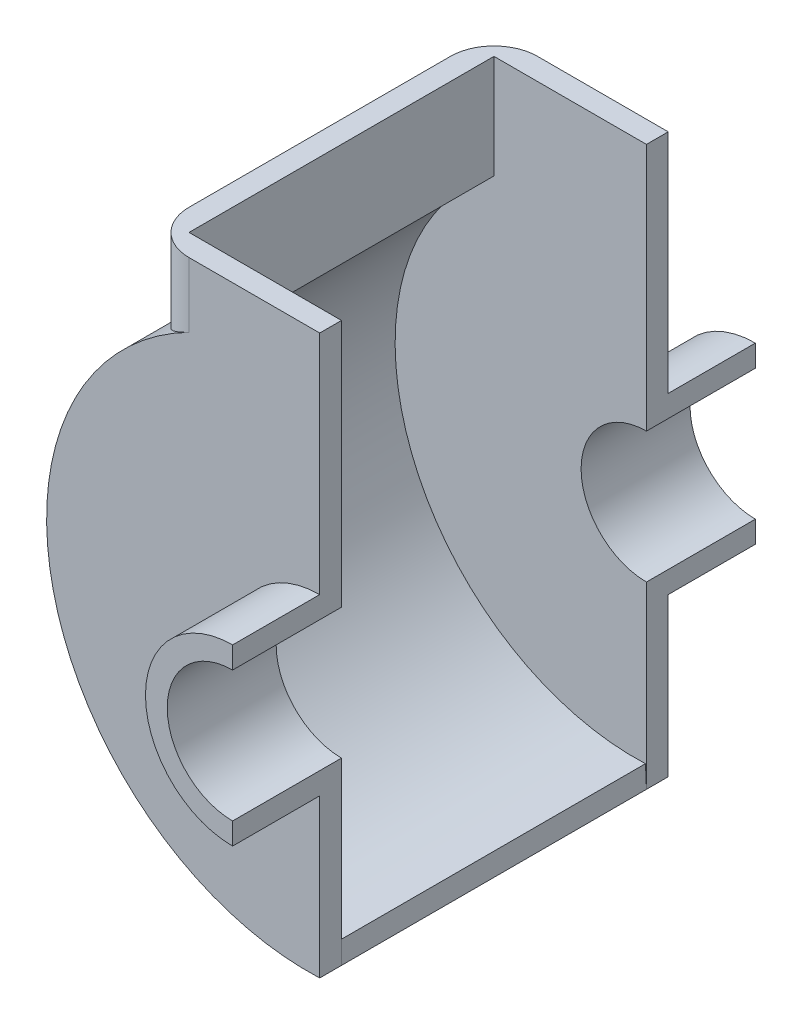
ISO-10303-21;
HEADER;
FILE_DESCRIPTION(('STEP AP214'),'2;1');
FILE_NAME('part.step','',(''),(''),'','','');
FILE_SCHEMA(('AUTOMOTIVE_DESIGN { 1 0 10303 214 1 1 1 1 }'));
ENDSEC;
DATA;
#1=APPLICATION_CONTEXT('core data for automotive mechanical design processes');
#2=APPLICATION_PROTOCOL_DEFINITION('international standard','automotive_design',2000,#1);
#3=PRODUCT_CONTEXT('',#1,'mechanical');
#4=PRODUCT('Part','Part','',(#3));
#5=PRODUCT_RELATED_PRODUCT_CATEGORY('part','',(#4));
#6=PRODUCT_DEFINITION_FORMATION('','',#4);
#7=PRODUCT_DEFINITION_CONTEXT('part definition',#1,'design');
#8=PRODUCT_DEFINITION('design','',#6,#7);
#9=PRODUCT_DEFINITION_SHAPE('','',#8);
#10=(LENGTH_UNIT() NAMED_UNIT(*) SI_UNIT(.MILLI.,.METRE.));
#11=(NAMED_UNIT(*) PLANE_ANGLE_UNIT() SI_UNIT($,.RADIAN.));
#12=(NAMED_UNIT(*) SI_UNIT($,.STERADIAN.) SOLID_ANGLE_UNIT());
#13=UNCERTAINTY_MEASURE_WITH_UNIT(LENGTH_MEASURE(1.E-05),#10,'distance_accuracy_value','');
#14=(GEOMETRIC_REPRESENTATION_CONTEXT(3) GLOBAL_UNCERTAINTY_ASSIGNED_CONTEXT((#13)) GLOBAL_UNIT_ASSIGNED_CONTEXT((#10,
#11,#12)) REPRESENTATION_CONTEXT('',''));
#15=CARTESIAN_POINT('',(0.,0.,0.));
#16=DIRECTION('',(0.,0.,1.));
#17=DIRECTION('',(1.,0.,0.));
#18=AXIS2_PLACEMENT_3D('',#15,#16,#17);
#19=CARTESIAN_POINT('',(0.,0.,0.));
#20=DIRECTION('',(0.,0.,1.));
#21=DIRECTION('',(1.,0.,0.));
#22=AXIS2_PLACEMENT_3D('',#19,#20,#21);
#23=PLANE('',#22);
#24=DIRECTION('',(0.,1.,0.));
#25=VECTOR('',#24,1.);
#26=CARTESIAN_POINT('',(-35.,72.,0.));
#27=LINE('',#26,#25);
#28=CARTESIAN_POINT('',(-35.,72.,0.));
#29=VERTEX_POINT('',#28);
#30=CARTESIAN_POINT('',(-35.,48.2294254543984,0.));
#31=VERTEX_POINT('',#30);
#32=EDGE_CURVE('E271',#29,#31,#27,.F.);
#33=ORIENTED_EDGE('',*,*,#32,.F.);
#34=DIRECTION('',(-1.,0.,0.));
#35=VECTOR('',#34,1.);
#36=CARTESIAN_POINT('',(0.,72.,0.));
#37=LINE('',#36,#35);
#38=CARTESIAN_POINT('',(0.,72.,0.));
#39=VERTEX_POINT('',#38);
#40=EDGE_CURVE('E269',#39,#29,#37,.T.);
#41=ORIENTED_EDGE('',*,*,#40,.F.);
#42=DIRECTION('',(0.,1.,0.));
#43=VECTOR('',#42,1.);
#44=CARTESIAN_POINT('',(0.,15.,0.));
#45=LINE('',#44,#43);
#46=CARTESIAN_POINT('',(0.,15.,0.));
#47=VERTEX_POINT('',#46);
#48=EDGE_CURVE('E347',#47,#39,#45,.T.);
#49=ORIENTED_EDGE('',*,*,#48,.F.);
#50=CARTESIAN_POINT('',(0.,0.,0.));
#51=DIRECTION('',(0.,0.,-1.));
#52=DIRECTION('',(1.,0.,0.));
#53=AXIS2_PLACEMENT_3D('',#50,#51,#52);
#54=CIRCLE('',#53,15.);
#55=CARTESIAN_POINT('',(0.,-15.,0.));
#56=VERTEX_POINT('',#55);
#57=EDGE_CURVE('E328',#56,#47,#54,.T.);
#58=ORIENTED_EDGE('',*,*,#57,.F.);
#59=DIRECTION('',(0.,1.,0.));
#60=VECTOR('',#59,1.);
#61=CARTESIAN_POINT('',(0.,-15.,0.));
#62=LINE('',#61,#60);
#63=CARTESIAN_POINT('',(0.,-56.2204786512153,0.));
#64=VERTEX_POINT('',#63);
#65=EDGE_CURVE('E334',#64,#56,#62,.T.);
#66=ORIENTED_EDGE('',*,*,#65,.F.);
#67=DIRECTION('',(-0.0448600408326044,0.998993281627308,0.));
#68=VECTOR('',#67,1.);
#69=CARTESIAN_POINT('',(0.,-56.2204786512153,0.));
#70=LINE('',#69,#68);
#71=CARTESIAN_POINT('',(-0.224300204163022,-51.2255122430787,0.));
#72=VERTEX_POINT('',#71);
#73=EDGE_CURVE('E270',#64,#72,#70,.T.);
#74=ORIENTED_EDGE('',*,*,#73,.T.);
#75=CARTESIAN_POINT('',(-2.69160244995626,3.71911824642318,0.));
#76=DIRECTION('',(0.,0.,-1.));
#77=DIRECTION('',(-1.,0.,0.));
#78=AXIS2_PLACEMENT_3D('',#75,#76,#77);
#79=CIRCLE('',#78,55.);
#80=EDGE_CURVE('E266',#31,#72,#79,.F.);
#81=ORIENTED_EDGE('',*,*,#80,.F.);
#82=EDGE_LOOP('',(#33,#41,#49,#58,#66,#74,#81));
#83=FACE_BOUND('',#82,.T.);
#84=ADVANCED_FACE('F38',(#83),#23,.F.);
#85=CARTESIAN_POINT('',(0.,0.,25.));
#86=DIRECTION('',(0.,0.,-1.));
#87=DIRECTION('',(-1.,0.,0.));
#88=AXIS2_PLACEMENT_3D('',#85,#86,#87);
#89=CYLINDRICAL_SURFACE('',#88,15.);
#90=DIRECTION('',(0.,0.,-1.));
#91=VECTOR('',#90,1.);
#92=CARTESIAN_POINT('',(0.,-15.,25.));
#93=LINE('',#92,#91);
#94=CARTESIAN_POINT('',(0.,-15.,25.));
#95=VERTEX_POINT('',#94);
#96=EDGE_CURVE('E343',#95,#56,#93,.T.);
#97=ORIENTED_EDGE('',*,*,#96,.T.);
#98=ORIENTED_EDGE('',*,*,#57,.T.);
#99=DIRECTION('',(0.,0.,-1.));
#100=VECTOR('',#99,1.);
#101=CARTESIAN_POINT('',(0.,15.,25.));
#102=LINE('',#101,#100);
#103=CARTESIAN_POINT('',(0.,15.,25.));
#104=VERTEX_POINT('',#103);
#105=EDGE_CURVE('E362',#104,#47,#102,.T.);
#106=ORIENTED_EDGE('',*,*,#105,.F.);
#107=CARTESIAN_POINT('',(0.,0.,25.));
#108=DIRECTION('',(0.,0.,-1.));
#109=DIRECTION('',(1.,0.,0.));
#110=AXIS2_PLACEMENT_3D('',#107,#108,#109);
#111=CIRCLE('',#110,15.);
#112=EDGE_CURVE('E329',#95,#104,#111,.T.);
#113=ORIENTED_EDGE('',*,*,#112,.F.);
#114=EDGE_LOOP('',(#97,#98,#106,#113));
#115=FACE_BOUND('',#114,.T.);
#116=ADVANCED_FACE('F397',(#115),#89,.F.);
#117=CARTESIAN_POINT('',(0.,15.,25.));
#118=DIRECTION('',(-1.,0.,0.));
#119=DIRECTION('',(0.,0.,1.));
#120=AXIS2_PLACEMENT_3D('',#117,#118,#119);
#121=PLANE('',#120);
#122=ORIENTED_EDGE('',*,*,#105,.T.);
#123=ORIENTED_EDGE('',*,*,#48,.T.);
#124=DIRECTION('',(0.,0.,-1.));
#125=VECTOR('',#124,1.);
#126=CARTESIAN_POINT('',(0.,72.,5.));
#127=LINE('',#126,#125);
#128=CARTESIAN_POINT('',(0.,72.,5.));
#129=VERTEX_POINT('',#128);
#130=EDGE_CURVE('E321',#129,#39,#127,.T.);
#131=ORIENTED_EDGE('',*,*,#130,.F.);
#132=DIRECTION('',(0.,1.,0.));
#133=VECTOR('',#132,1.);
#134=CARTESIAN_POINT('',(0.,15.,5.));
#135=LINE('',#134,#133);
#136=CARTESIAN_POINT('',(0.,20.,5.));
#137=VERTEX_POINT('',#136);
#138=EDGE_CURVE('E294',#137,#129,#135,.T.);
#139=ORIENTED_EDGE('',*,*,#138,.F.);
#140=DIRECTION('',(0.,0.,-1.));
#141=VECTOR('',#140,1.);
#142=CARTESIAN_POINT('',(0.,20.,25.));
#143=LINE('',#142,#141);
#144=CARTESIAN_POINT('',(0.,20.,25.));
#145=VERTEX_POINT('',#144);
#146=EDGE_CURVE('E359',#145,#137,#143,.T.);
#147=ORIENTED_EDGE('',*,*,#146,.F.);
#148=DIRECTION('',(0.,1.,0.));
#149=VECTOR('',#148,1.);
#150=CARTESIAN_POINT('',(0.,15.,25.));
#151=LINE('',#150,#149);
#152=EDGE_CURVE('E333',#104,#145,#151,.T.);
#153=ORIENTED_EDGE('',*,*,#152,.F.);
#154=EDGE_LOOP('',(#122,#123,#131,#139,#147,#153));
#155=FACE_BOUND('',#154,.T.);
#156=ADVANCED_FACE('F400',(#155),#121,.F.);
#157=CARTESIAN_POINT('',(0.,0.,25.));
#158=DIRECTION('',(0.,0.,-1.));
#159=DIRECTION('',(-1.,0.,0.));
#160=AXIS2_PLACEMENT_3D('',#157,#158,#159);
#161=CYLINDRICAL_SURFACE('',#160,20.);
#162=ORIENTED_EDGE('',*,*,#146,.T.);
#163=CARTESIAN_POINT('',(0.,0.,5.));
#164=DIRECTION('',(0.,0.,1.));
#165=DIRECTION('',(1.,0.,0.));
#166=AXIS2_PLACEMENT_3D('',#163,#164,#165);
#167=CIRCLE('',#166,20.);
#168=CARTESIAN_POINT('',(0.,-20.,5.));
#169=VERTEX_POINT('',#168);
#170=EDGE_CURVE('E325',#137,#169,#167,.T.);
#171=ORIENTED_EDGE('',*,*,#170,.T.);
#172=DIRECTION('',(0.,0.,-1.));
#173=VECTOR('',#172,1.);
#174=CARTESIAN_POINT('',(0.,-20.,25.));
#175=LINE('',#174,#173);
#176=CARTESIAN_POINT('',(0.,-20.,25.));
#177=VERTEX_POINT('',#176);
#178=EDGE_CURVE('E355',#177,#169,#175,.T.);
#179=ORIENTED_EDGE('',*,*,#178,.F.);
#180=CARTESIAN_POINT('',(0.,0.,25.));
#181=DIRECTION('',(0.,0.,1.));
#182=DIRECTION('',(1.,0.,0.));
#183=AXIS2_PLACEMENT_3D('',#180,#181,#182);
#184=CIRCLE('',#183,20.);
#185=EDGE_CURVE('E337',#145,#177,#184,.T.);
#186=ORIENTED_EDGE('',*,*,#185,.F.);
#187=EDGE_LOOP('',(#162,#171,#179,#186));
#188=FACE_BOUND('',#187,.T.);
#189=ADVANCED_FACE('F404',(#188),#161,.T.);
#190=CARTESIAN_POINT('',(0.,-15.,25.));
#191=DIRECTION('',(-1.,0.,0.));
#192=DIRECTION('',(0.,0.,1.));
#193=AXIS2_PLACEMENT_3D('',#190,#191,#192);
#194=PLANE('',#193);
#195=ORIENTED_EDGE('',*,*,#178,.T.);
#196=DIRECTION('',(0.,1.,0.));
#197=VECTOR('',#196,1.);
#198=CARTESIAN_POINT('',(0.,-20.,5.));
#199=LINE('',#198,#197);
#200=CARTESIAN_POINT('',(0.,-56.2204786512153,5.));
#201=VERTEX_POINT('',#200);
#202=EDGE_CURVE('E302',#201,#169,#199,.T.);
#203=ORIENTED_EDGE('',*,*,#202,.F.);
#204=DIRECTION('',(0.,0.,-1.));
#205=VECTOR('',#204,1.);
#206=CARTESIAN_POINT('',(0.,-56.2204786512153,5.));
#207=LINE('',#206,#205);
#208=EDGE_CURVE('E306',#201,#64,#207,.T.);
#209=ORIENTED_EDGE('',*,*,#208,.T.);
#210=ORIENTED_EDGE('',*,*,#65,.T.);
#211=ORIENTED_EDGE('',*,*,#96,.F.);
#212=DIRECTION('',(0.,1.,0.));
#213=VECTOR('',#212,1.);
#214=CARTESIAN_POINT('',(0.,-15.,25.));
#215=LINE('',#214,#213);
#216=EDGE_CURVE('E340',#177,#95,#215,.T.);
#217=ORIENTED_EDGE('',*,*,#216,.F.);
#218=EDGE_LOOP('',(#195,#203,#209,#210,#211,#217));
#219=FACE_BOUND('',#218,.T.);
#220=ADVANCED_FACE('F408',(#219),#194,.F.);
#221=CARTESIAN_POINT('',(0.,0.,25.));
#222=DIRECTION('',(0.,0.,1.));
#223=DIRECTION('',(1.,0.,0.));
#224=AXIS2_PLACEMENT_3D('',#221,#222,#223);
#225=PLANE('',#224);
#226=ORIENTED_EDGE('',*,*,#112,.T.);
#227=ORIENTED_EDGE('',*,*,#152,.T.);
#228=ORIENTED_EDGE('',*,*,#185,.T.);
#229=ORIENTED_EDGE('',*,*,#216,.T.);
#230=EDGE_LOOP('',(#226,#227,#228,#229));
#231=FACE_BOUND('',#230,.T.);
#232=ADVANCED_FACE('F412',(#231),#225,.T.);
#233=CARTESIAN_POINT('',(-2.69160244995626,3.71911824642318,5.));
#234=DIRECTION('',(0.,0.,1.));
#235=DIRECTION('',(1.,0.,0.));
#236=AXIS2_PLACEMENT_3D('',#233,#234,#235);
#237=PLANE('',#236);
#238=DIRECTION('',(-1.,0.,0.));
#239=VECTOR('',#238,1.);
#240=CARTESIAN_POINT('',(0.,72.,5.));
#241=LINE('',#240,#239);
#242=CARTESIAN_POINT('',(-30.,72.,5.));
#243=VERTEX_POINT('',#242);
#244=EDGE_CURVE('E297',#129,#243,#241,.T.);
#245=ORIENTED_EDGE('',*,*,#244,.T.);
#246=DIRECTION('',(0.,-1.,0.));
#247=VECTOR('',#246,1.);
#248=CARTESIAN_POINT('',(-30.,50.7093669396137,5.));
#249=LINE('',#248,#247);
#250=CARTESIAN_POINT('',(-30.,57.1443128950977,5.));
#251=VERTEX_POINT('',#250);
#252=EDGE_CURVE('E379',#243,#251,#249,.T.);
#253=ORIENTED_EDGE('',*,*,#252,.T.);
#254=CARTESIAN_POINT('',(-2.69160244995626,3.71911824642318,5.));
#255=DIRECTION('',(0.,0.,1.));
#256=DIRECTION('',(1.,0.,0.));
#257=AXIS2_PLACEMENT_3D('',#254,#255,#256);
#258=CIRCLE('',#257,60.);
#259=EDGE_CURVE('E59',#251,#201,#258,.T.);
#260=ORIENTED_EDGE('',*,*,#259,.T.);
#261=ORIENTED_EDGE('',*,*,#202,.T.);
#262=ORIENTED_EDGE('',*,*,#170,.F.);
#263=ORIENTED_EDGE('',*,*,#138,.T.);
#264=EDGE_LOOP('',(#245,#253,#260,#261,#262,#263));
#265=FACE_BOUND('',#264,.T.);
#266=ADVANCED_FACE('F419',(#265),#237,.T.);
#267=CARTESIAN_POINT('',(0.,72.,5.));
#268=DIRECTION('',(0.,-1.,0.));
#269=DIRECTION('',(0.,0.,-1.));
#270=AXIS2_PLACEMENT_3D('',#267,#268,#269);
#271=PLANE('',#270);
#272=DIRECTION('',(-1.,0.,0.));
#273=VECTOR('',#272,1.);
#274=CARTESIAN_POINT('',(0.,72.,-75.));
#275=LINE('',#274,#273);
#276=CARTESIAN_POINT('',(0.,72.,-75.));
#277=VERTEX_POINT('',#276);
#278=CARTESIAN_POINT('',(-30.,72.,-75.));
#279=VERTEX_POINT('',#278);
#280=EDGE_CURVE('E177',#277,#279,#275,.T.);
#281=ORIENTED_EDGE('',*,*,#280,.T.);
#282=CARTESIAN_POINT('',(-30.,72.,-65.));
#283=DIRECTION('',(0.,-1.,0.));
#284=DIRECTION('',(0.,0.,-1.));
#285=AXIS2_PLACEMENT_3D('',#282,#283,#284);
#286=CIRCLE('',#285,10.);
#287=CARTESIAN_POINT('',(-40.,72.,-65.));
#288=VERTEX_POINT('',#287);
#289=EDGE_CURVE('E376',#279,#288,#286,.F.);
#290=ORIENTED_EDGE('',*,*,#289,.T.);
#291=DIRECTION('',(0.,0.,-1.));
#292=VECTOR('',#291,1.);
#293=CARTESIAN_POINT('',(-40.,72.,5.));
#294=LINE('',#293,#292);
#295=CARTESIAN_POINT('',(-40.,72.,-5.));
#296=VERTEX_POINT('',#295);
#297=EDGE_CURVE('E317',#296,#288,#294,.T.);
#298=ORIENTED_EDGE('',*,*,#297,.F.);
#299=CARTESIAN_POINT('',(-30.,72.,-5.));
#300=DIRECTION('',(0.,-1.,0.));
#301=DIRECTION('',(0.,0.,-1.));
#302=AXIS2_PLACEMENT_3D('',#299,#300,#301);
#303=CIRCLE('',#302,10.);
#304=EDGE_CURVE('E67',#296,#243,#303,.F.);
#305=ORIENTED_EDGE('',*,*,#304,.T.);
#306=ORIENTED_EDGE('',*,*,#244,.F.);
#307=ORIENTED_EDGE('',*,*,#130,.T.);
#308=ORIENTED_EDGE('',*,*,#40,.T.);
#309=DIRECTION('',(0.,0.,1.));
#310=VECTOR('',#309,1.);
#311=CARTESIAN_POINT('',(-35.,72.,-95.002));
#312=LINE('',#311,#310);
#313=CARTESIAN_POINT('',(-35.,72.,-70.));
#314=VERTEX_POINT('',#313);
#315=EDGE_CURVE('E285',#314,#29,#312,.T.);
#316=ORIENTED_EDGE('',*,*,#315,.F.);
#317=DIRECTION('',(-1.,0.,0.));
#318=VECTOR('',#317,1.);
#319=CARTESIAN_POINT('',(0.,72.,-70.));
#320=LINE('',#319,#318);
#321=CARTESIAN_POINT('',(0.,72.,-70.));
#322=VERTEX_POINT('',#321);
#323=EDGE_CURVE('E194',#322,#314,#320,.T.);
#324=ORIENTED_EDGE('',*,*,#323,.F.);
#325=DIRECTION('',(0.,0.,1.));
#326=VECTOR('',#325,1.);
#327=CARTESIAN_POINT('',(0.,72.,-75.));
#328=LINE('',#327,#326);
#329=EDGE_CURVE('E191',#277,#322,#328,.T.);
#330=ORIENTED_EDGE('',*,*,#329,.F.);
#331=EDGE_LOOP('',(#281,#290,#298,#305,#306,#307,#308,#316,#324,#330));
#332=FACE_BOUND('',#331,.T.);
#333=ADVANCED_FACE('F192',(#332),#271,.F.);
#334=CARTESIAN_POINT('',(-40.,72.,5.));
#335=DIRECTION('',(1.,0.,0.));
#336=DIRECTION('',(0.,0.,-1.));
#337=AXIS2_PLACEMENT_3D('',#334,#335,#336);
#338=PLANE('',#337);
#339=ORIENTED_EDGE('',*,*,#297,.T.);
#340=DIRECTION('',(0.,-1.,0.));
#341=VECTOR('',#340,1.);
#342=CARTESIAN_POINT('',(-40.,50.7093669396137,-65.));
#343=LINE('',#342,#341);
#344=CARTESIAN_POINT('',(-40.,50.7093669396137,-65.));
#345=VERTEX_POINT('',#344);
#346=EDGE_CURVE('E368',#288,#345,#343,.T.);
#347=ORIENTED_EDGE('',*,*,#346,.T.);
#348=DIRECTION('',(0.,0.,-1.));
#349=VECTOR('',#348,1.);
#350=CARTESIAN_POINT('',(-40.,50.7093669396137,5.));
#351=LINE('',#350,#349);
#352=CARTESIAN_POINT('',(-40.,50.7093669396137,-5.));
#353=VERTEX_POINT('',#352);
#354=EDGE_CURVE('E313',#353,#345,#351,.T.);
#355=ORIENTED_EDGE('',*,*,#354,.F.);
#356=DIRECTION('',(0.,-1.,0.));
#357=VECTOR('',#356,1.);
#358=CARTESIAN_POINT('',(-40.,72.,-5.));
#359=LINE('',#358,#357);
#360=EDGE_CURVE('E365',#353,#296,#359,.F.);
#361=ORIENTED_EDGE('',*,*,#360,.T.);
#362=EDGE_LOOP('',(#339,#347,#355,#361));
#363=FACE_BOUND('',#362,.T.);
#364=ADVANCED_FACE('F422',(#363),#338,.F.);
#365=CARTESIAN_POINT('',(-2.69160244995626,3.71911824642318,5.));
#366=DIRECTION('',(0.,0.,-1.));
#367=DIRECTION('',(-1.,0.,0.));
#368=AXIS2_PLACEMENT_3D('',#365,#366,#367);
#369=CYLINDRICAL_SURFACE('',#368,60.);
#370=ORIENTED_EDGE('',*,*,#259,.F.);
#371=CARTESIAN_POINT('',(-30.,57.1443128950977,5.));
#372=CARTESIAN_POINT('',(-30.190538897317,57.0469210606692,4.99999708536492));
#373=CARTESIAN_POINT('',(-30.3805147914979,56.948525775995,4.99455370629424));
#374=CARTESIAN_POINT('',(-30.75891230698,56.7499746265133,4.97296256099692));
#375=CARTESIAN_POINT('',(-30.947334062707,56.6498189163716,4.95681573061193));
#376=CARTESIAN_POINT('',(-31.5094862976282,56.3471567076638,4.89260501338956));
#377=CARTESIAN_POINT('',(-31.880297093462,56.1423562462212,4.82877053642204));
#378=CARTESIAN_POINT('',(-32.6108503452513,55.7288785255673,4.66044687014655));
#379=CARTESIAN_POINT('',(-32.9705784450502,55.5201967568215,4.5559071602511));
#380=CARTESIAN_POINT('',(-33.6754956714059,55.101666612462,4.30754159315364));
#381=CARTESIAN_POINT('',(-34.0206862325668,54.8918183542851,4.16371962296678));
#382=CARTESIAN_POINT('',(-34.6420569546333,54.5057417033962,3.86293128558659));
#383=CARTESIAN_POINT('',(-34.9207139970056,54.3292827647998,3.7113445247113));
#384=CARTESIAN_POINT('',(-35.4637299438821,53.979360305732,3.38144120616671));
#385=CARTESIAN_POINT('',(-35.7280899509816,53.8058965549745,3.20312671376685));
#386=CARTESIAN_POINT('',(-36.2403276222433,53.4642459265314,2.82051147805685));
#387=CARTESIAN_POINT('',(-36.4882245690261,53.2960530018185,2.61624198252485));
#388=CARTESIAN_POINT('',(-36.9657987213814,52.9670977771929,2.18204363839071));
#389=CARTESIAN_POINT('',(-37.1954798717616,52.8063338716183,1.95212037146342));
#390=CARTESIAN_POINT('',(-37.5875633239988,52.5281011751213,1.51882894343778));
#391=CARTESIAN_POINT('',(-37.7538791319109,52.4087013248008,1.32022771834976));
#392=CARTESIAN_POINT('',(-38.0725092300409,52.1776586894909,0.907831466152881));
#393=CARTESIAN_POINT('',(-38.2248246340889,52.0660152875946,0.694037650124744));
#394=CARTESIAN_POINT('',(-38.5139039172429,51.8522152188696,0.251964658931181));
#395=CARTESIAN_POINT('',(-38.6506806636196,51.7500507157867,0.0236977164070533));
#396=CARTESIAN_POINT('',(-38.9072521057515,51.5568910826527,-0.446694172573238));
#397=CARTESIAN_POINT('',(-39.0270498702709,51.4658939346248,-0.688816603669124));
#398=CARTESIAN_POINT('',(-39.2298600767428,51.3108113409173,-1.14495848516819));
#399=CARTESIAN_POINT('',(-39.3156826671516,51.2447604926586,-1.35706327569234));
#400=CARTESIAN_POINT('',(-39.473327146316,51.1228592542836,-1.78924354203654));
#401=CARTESIAN_POINT('',(-39.5451516186816,51.0670069819529,-2.00931753808482));
#402=CARTESIAN_POINT('',(-39.6737652762895,50.9666185854297,-2.4559526988883));
#403=CARTESIAN_POINT('',(-39.7305785408437,50.9220643428746,-2.68250282032344));
#404=CARTESIAN_POINT('',(-39.8284645651493,50.8450915037139,-3.1409157084048));
#405=CARTESIAN_POINT('',(-39.8695436290013,50.8126680468811,-3.37277630779789));
#406=CARTESIAN_POINT('',(-39.9347735887154,50.7610986212181,-3.83633919584791));
#407=CARTESIAN_POINT('',(-39.9591978629036,50.7417382877031,-4.06797841909135));
#408=CARTESIAN_POINT('',(-39.9836590794289,50.7223373441755,-4.41676834547742));
#409=CARTESIAN_POINT('',(-39.9897836235517,50.717476950818,-4.53326879565177));
#410=CARTESIAN_POINT('',(-39.9979547888688,50.710990839667,-4.76650755665025));
#411=CARTESIAN_POINT('',(-40.0000012298058,50.7093652648566,-4.88324587776029));
#412=CARTESIAN_POINT('',(-40.,50.7093669396137,-5.));
#413=B_SPLINE_CURVE_WITH_KNOTS('',3,(#371,#372,#373,#374,#375,#376,#377,#378,#379,#380,#381,
#382,#383,#384,#385,#386,#387,#388,#389,#390,#391,#392,#393,#394,#395,#396,#397,#398,#399,#400,
#401,#402,#403,#404,#405,#406,#407,#408,#409,#410,#411,#412),.UNSPECIFIED.,.F.,.F.,(4,2,2,2,2,2,
2,2,2,2,2,2,2,2,2,2,2,2,2,2,4),(0.,0.641803178249632,1.28355024871386,2.5663959196848,
3.85083887339741,5.13515477633583,6.22293023651776,7.31062168686181,8.39701583450129,
9.48317406683329,10.3381056269316,11.1929691122574,12.0471194602227,12.9011152325057,
13.6148657731352,14.3284844529653,15.0409513782335,15.7531325455323,16.4533225333117,
16.8035089532444,17.1537108515104),.UNSPECIFIED.);
#414=EDGE_CURVE('E11',#251,#353,#413,.T.);
#415=ORIENTED_EDGE('',*,*,#414,.T.);
#416=ORIENTED_EDGE('',*,*,#354,.T.);
#417=CARTESIAN_POINT('',(-40.,50.7093669396137,-65.));
#418=CARTESIAN_POINT('',(-40.0000013854241,50.709365037176,-65.1209877704057));
#419=CARTESIAN_POINT('',(-39.9978037277104,50.7111107901904,-65.2419577155002));
#420=CARTESIAN_POINT('',(-39.9890299321157,50.7180751385238,-65.4836318755443));
#421=CARTESIAN_POINT('',(-39.9824540415053,50.7232935377172,-65.6043361051146));
#422=CARTESIAN_POINT('',(-39.9562041696047,50.7441115208993,-65.9655038961739));
#423=CARTESIAN_POINT('',(-39.9300079116922,50.7648739751828,-66.2052460903645));
#424=CARTESIAN_POINT('',(-39.860928212612,50.8194698957167,-66.6789955288607));
#425=CARTESIAN_POINT('',(-39.8181641105856,50.8532098718799,-66.9130313428279));
#426=CARTESIAN_POINT('',(-39.7166414999679,50.9330001666739,-67.3754846896533));
#427=CARTESIAN_POINT('',(-39.6578810599441,50.9790519718498,-67.6039015404319));
#428=CARTESIAN_POINT('',(-39.525424769484,51.082358759329,-68.0530214659712));
#429=CARTESIAN_POINT('',(-39.451771006559,51.1395821560899,-68.2737442674053));
#430=CARTESIAN_POINT('',(-39.2903894267431,51.2642462269937,-68.707045253923));
#431=CARTESIAN_POINT('',(-39.2026560515299,51.3316909356989,-68.9196201811753));
#432=CARTESIAN_POINT('',(-38.9196000643781,51.5478599078081,-69.5441830202786));
#433=CARTESIAN_POINT('',(-38.7045230044406,51.7103389246188,-69.9426718997058));
#434=CARTESIAN_POINT('',(-38.2077004899167,52.0793386724391,-70.733398695761));
#435=CARTESIAN_POINT('',(-37.9216132839565,52.2885509305428,-71.1216033359211));
#436=CARTESIAN_POINT('',(-37.3049128355053,52.7299626741384,-71.8457750590678));
#437=CARTESIAN_POINT('',(-36.9742854415217,52.962169459309,-72.1817254662297));
#438=CARTESIAN_POINT('',(-36.2027000072365,53.4912714665877,-72.8640838888955));
#439=CARTESIAN_POINT('',(-35.7530919738382,53.791582124589,-73.1981586293145));
#440=CARTESIAN_POINT('',(-35.0458956689218,54.2491027208437,-73.6380678733325));
#441=CARTESIAN_POINT('',(-34.8045275147456,54.4028903231833,-73.7745744167344));
#442=CARTESIAN_POINT('',(-34.3118487459069,54.7117095402929,-74.0268773181));
#443=CARTESIAN_POINT('',(-34.060537423491,54.8667412429894,-74.1426721985598));
#444=CARTESIAN_POINT('',(-33.5062949154777,55.2028695591703,-74.3707068832076));
#445=CARTESIAN_POINT('',(-33.2017777432077,55.3839749049132,-74.4790901247902));
#446=CARTESIAN_POINT('',(-32.5827817462961,55.7445521833,-74.6661147976051));
#447=CARTESIAN_POINT('',(-32.2683023491592,55.924024021306,-74.7447545162055));
#448=CARTESIAN_POINT('',(-31.631309074548,56.2798087679203,-74.8713875800533));
#449=CARTESIAN_POINT('',(-31.3087924839198,56.456120574283,-74.9193704266231));
#450=CARTESIAN_POINT('',(-30.6580712889965,56.804086931129,-74.9836807705773));
#451=CARTESIAN_POINT('',(-30.3298655939672,56.9757405719805,-75.0000021284469));
#452=CARTESIAN_POINT('',(-30.,57.1443128950977,-75.));
#453=B_SPLINE_CURVE_WITH_KNOTS('',3,(#417,#418,#419,#420,#421,#422,#423,#424,#425,#426,#427,
#428,#429,#430,#431,#432,#433,#434,#435,#436,#437,#438,#439,#440,#441,#442,#443,#444,#445,#446,
#447,#448,#449,#450,#451,#452),.UNSPECIFIED.,.F.,.F.,(4,2,2,2,2,2,2,2,2,2,2,2,2,2,2,2,2,4),(0.,
0.362895565640964,0.725770637669876,1.45085277838815,2.17080640610013,2.89084700116311,
3.60888055491684,4.32719827306459,5.76490485919343,7.33641484237967,8.90842531503938,
10.8070964642481,11.7577013982944,12.7083741184438,13.8185608202113,14.9288114367944,
16.0394420635817,17.1502880324796),.UNSPECIFIED.);
#454=CARTESIAN_POINT('',(-30.,57.1443128950977,-75.));
#455=VERTEX_POINT('',#454);
#456=EDGE_CURVE('E53',#345,#455,#453,.T.);
#457=ORIENTED_EDGE('',*,*,#456,.T.);
#458=CARTESIAN_POINT('',(-2.69160244995626,3.71911824642318,-75.));
#459=DIRECTION('',(0.,0.,1.));
#460=DIRECTION('',(1.,0.,0.));
#461=AXIS2_PLACEMENT_3D('',#458,#459,#460);
#462=CIRCLE('',#461,60.);
#463=CARTESIAN_POINT('',(0.,-56.2204786512153,-75.));
#464=VERTEX_POINT('',#463);
#465=EDGE_CURVE('E188',#455,#464,#462,.T.);
#466=ORIENTED_EDGE('',*,*,#465,.T.);
#467=DIRECTION('',(0.,0.,1.));
#468=VECTOR('',#467,1.);
#469=CARTESIAN_POINT('',(0.,-56.2204786512153,-75.));
#470=LINE('',#469,#468);
#471=CARTESIAN_POINT('',(0.,-56.2204786512153,-70.));
#472=VERTEX_POINT('',#471);
#473=EDGE_CURVE('E199',#464,#472,#470,.T.);
#474=ORIENTED_EDGE('',*,*,#473,.T.);
#475=DIRECTION('',(0.,0.,1.));
#476=VECTOR('',#475,1.);
#477=CARTESIAN_POINT('',(0.,-56.2204786512153,-95.002));
#478=LINE('',#477,#476);
#479=EDGE_CURVE('E282',#472,#64,#478,.T.);
#480=ORIENTED_EDGE('',*,*,#479,.T.);
#481=ORIENTED_EDGE('',*,*,#208,.F.);
#482=EDGE_LOOP('',(#370,#415,#416,#457,#466,#474,#480,#481));
#483=FACE_BOUND('',#482,.T.);
#484=ADVANCED_FACE('F388',(#483),#369,.T.);
#485=CARTESIAN_POINT('',(0.,-56.2204786512153,-95.002));
#486=DIRECTION('',(0.998993281627308,0.0448600408326044,0.));
#487=DIRECTION('',(-0.0448600408326044,0.998993281627308,0.));
#488=AXIS2_PLACEMENT_3D('',#485,#486,#487);
#489=PLANE('',#488);
#490=ORIENTED_EDGE('',*,*,#479,.F.);
#491=DIRECTION('',(-0.0448600408326044,0.998993281627308,0.));
#492=VECTOR('',#491,1.);
#493=CARTESIAN_POINT('',(0.,-56.2204786512153,-70.));
#494=LINE('',#493,#492);
#495=CARTESIAN_POINT('',(-0.224300204163022,-51.2255122430787,-70.));
#496=VERTEX_POINT('',#495);
#497=EDGE_CURVE('E260',#472,#496,#494,.T.);
#498=ORIENTED_EDGE('',*,*,#497,.T.);
#499=DIRECTION('',(0.,0.,1.));
#500=VECTOR('',#499,1.);
#501=CARTESIAN_POINT('',(-0.224300204163022,-51.2255122430787,-95.002));
#502=LINE('',#501,#500);
#503=EDGE_CURVE('E264',#496,#72,#502,.T.);
#504=ORIENTED_EDGE('',*,*,#503,.T.);
#505=ORIENTED_EDGE('',*,*,#73,.F.);
#506=EDGE_LOOP('',(#490,#498,#504,#505));
#507=FACE_BOUND('',#506,.T.);
#508=ADVANCED_FACE('F428',(#507),#489,.T.);
#509=CARTESIAN_POINT('',(-2.69160244995626,3.71911824642318,-95.002));
#510=DIRECTION('',(0.,0.,1.));
#511=DIRECTION('',(1.,0.,0.));
#512=AXIS2_PLACEMENT_3D('',#509,#510,#511);
#513=CYLINDRICAL_SURFACE('',#512,55.);
#514=CARTESIAN_POINT('',(-2.69160244995626,3.71911824642318,-70.));
#515=DIRECTION('',(0.,0.,-1.));
#516=DIRECTION('',(-1.,0.,0.));
#517=AXIS2_PLACEMENT_3D('',#514,#515,#516);
#518=CIRCLE('',#517,55.);
#519=CARTESIAN_POINT('',(-35.,48.2294254543984,-70.));
#520=VERTEX_POINT('',#519);
#521=EDGE_CURVE('E265',#520,#496,#518,.F.);
#522=ORIENTED_EDGE('',*,*,#521,.F.);
#523=DIRECTION('',(0.,0.,1.));
#524=VECTOR('',#523,1.);
#525=CARTESIAN_POINT('',(-35.,48.2294254543984,-95.002));
#526=LINE('',#525,#524);
#527=EDGE_CURVE('E275',#520,#31,#526,.T.);
#528=ORIENTED_EDGE('',*,*,#527,.T.);
#529=ORIENTED_EDGE('',*,*,#80,.T.);
#530=ORIENTED_EDGE('',*,*,#503,.F.);
#531=EDGE_LOOP('',(#522,#528,#529,#530));
#532=FACE_BOUND('',#531,.T.);
#533=ADVANCED_FACE('F453',(#532),#513,.F.);
#534=CARTESIAN_POINT('',(-35.,72.,-95.002));
#535=DIRECTION('',(-1.,0.,0.));
#536=DIRECTION('',(0.,0.,1.));
#537=AXIS2_PLACEMENT_3D('',#534,#535,#536);
#538=PLANE('',#537);
#539=DIRECTION('',(0.,-1.,0.));
#540=VECTOR('',#539,1.);
#541=CARTESIAN_POINT('',(-35.,72.,-70.));
#542=LINE('',#541,#540);
#543=EDGE_CURVE('E259',#314,#520,#542,.T.);
#544=ORIENTED_EDGE('',*,*,#543,.F.);
#545=ORIENTED_EDGE('',*,*,#315,.T.);
#546=ORIENTED_EDGE('',*,*,#32,.T.);
#547=ORIENTED_EDGE('',*,*,#527,.F.);
#548=EDGE_LOOP('',(#544,#545,#546,#547));
#549=FACE_BOUND('',#548,.T.);
#550=ADVANCED_FACE('F429',(#549),#538,.F.);
#551=CARTESIAN_POINT('',(0.,0.,-70.));
#552=DIRECTION('',(0.,0.,-1.));
#553=DIRECTION('',(1.,0.,0.));
#554=AXIS2_PLACEMENT_3D('',#551,#552,#553);
#555=PLANE('',#554);
#556=ORIENTED_EDGE('',*,*,#323,.T.);
#557=ORIENTED_EDGE('',*,*,#543,.T.);
#558=ORIENTED_EDGE('',*,*,#521,.T.);
#559=ORIENTED_EDGE('',*,*,#497,.F.);
#560=DIRECTION('',(0.,1.,0.));
#561=VECTOR('',#560,1.);
#562=CARTESIAN_POINT('',(0.,-15.,-70.));
#563=LINE('',#562,#561);
#564=CARTESIAN_POINT('',(0.,-15.,-70.));
#565=VERTEX_POINT('',#564);
#566=EDGE_CURVE('E227',#472,#565,#563,.T.);
#567=ORIENTED_EDGE('',*,*,#566,.T.);
#568=CARTESIAN_POINT('',(0.,0.,-70.));
#569=DIRECTION('',(0.,0.,-1.));
#570=DIRECTION('',(1.,0.,0.));
#571=AXIS2_PLACEMENT_3D('',#568,#569,#570);
#572=CIRCLE('',#571,15.);
#573=CARTESIAN_POINT('',(0.,15.,-70.));
#574=VERTEX_POINT('',#573);
#575=EDGE_CURVE('E221',#565,#574,#572,.T.);
#576=ORIENTED_EDGE('',*,*,#575,.T.);
#577=DIRECTION('',(0.,1.,0.));
#578=VECTOR('',#577,1.);
#579=CARTESIAN_POINT('',(0.,15.,-70.));
#580=LINE('',#579,#578);
#581=EDGE_CURVE('E241',#574,#322,#580,.T.);
#582=ORIENTED_EDGE('',*,*,#581,.T.);
#583=EDGE_LOOP('',(#556,#557,#558,#559,#567,#576,#582));
#584=FACE_BOUND('',#583,.T.);
#585=ADVANCED_FACE('F450',(#584),#555,.F.);
#586=CARTESIAN_POINT('',(0.,0.,-95.));
#587=DIRECTION('',(0.,0.,1.));
#588=DIRECTION('',(-1.,0.,0.));
#589=AXIS2_PLACEMENT_3D('',#586,#587,#588);
#590=CYLINDRICAL_SURFACE('',#589,15.);
#591=DIRECTION('',(0.,0.,1.));
#592=VECTOR('',#591,1.);
#593=CARTESIAN_POINT('',(0.,-15.,-95.));
#594=LINE('',#593,#592);
#595=CARTESIAN_POINT('',(0.,-15.,-95.));
#596=VERTEX_POINT('',#595);
#597=EDGE_CURVE('E237',#596,#565,#594,.T.);
#598=ORIENTED_EDGE('',*,*,#597,.F.);
#599=CARTESIAN_POINT('',(0.,0.,-95.));
#600=DIRECTION('',(0.,0.,-1.));
#601=DIRECTION('',(1.,0.,0.));
#602=AXIS2_PLACEMENT_3D('',#599,#600,#601);
#603=CIRCLE('',#602,15.);
#604=CARTESIAN_POINT('',(0.,15.,-95.));
#605=VERTEX_POINT('',#604);
#606=EDGE_CURVE('E222',#596,#605,#603,.T.);
#607=ORIENTED_EDGE('',*,*,#606,.T.);
#608=DIRECTION('',(0.,0.,1.));
#609=VECTOR('',#608,1.);
#610=CARTESIAN_POINT('',(0.,15.,-95.));
#611=LINE('',#610,#609);
#612=EDGE_CURVE('E255',#605,#574,#611,.T.);
#613=ORIENTED_EDGE('',*,*,#612,.T.);
#614=ORIENTED_EDGE('',*,*,#575,.F.);
#615=EDGE_LOOP('',(#598,#607,#613,#614));
#616=FACE_BOUND('',#615,.T.);
#617=ADVANCED_FACE('F468',(#616),#590,.F.);
#618=CARTESIAN_POINT('',(0.,15.,-95.));
#619=DIRECTION('',(-1.,0.,0.));
#620=DIRECTION('',(0.,0.,-1.));
#621=AXIS2_PLACEMENT_3D('',#618,#619,#620);
#622=PLANE('',#621);
#623=ORIENTED_EDGE('',*,*,#612,.F.);
#624=DIRECTION('',(0.,1.,0.));
#625=VECTOR('',#624,1.);
#626=CARTESIAN_POINT('',(0.,15.,-95.));
#627=LINE('',#626,#625);
#628=CARTESIAN_POINT('',(0.,20.,-95.));
#629=VERTEX_POINT('',#628);
#630=EDGE_CURVE('E226',#605,#629,#627,.T.);
#631=ORIENTED_EDGE('',*,*,#630,.T.);
#632=DIRECTION('',(0.,0.,1.));
#633=VECTOR('',#632,1.);
#634=CARTESIAN_POINT('',(0.,20.,-95.));
#635=LINE('',#634,#633);
#636=CARTESIAN_POINT('',(0.,20.,-75.));
#637=VERTEX_POINT('',#636);
#638=EDGE_CURVE('E205',#629,#637,#635,.T.);
#639=ORIENTED_EDGE('',*,*,#638,.T.);
#640=DIRECTION('',(0.,1.,0.));
#641=VECTOR('',#640,1.);
#642=CARTESIAN_POINT('',(0.,15.,-75.));
#643=LINE('',#642,#641);
#644=EDGE_CURVE('E182',#637,#277,#643,.T.);
#645=ORIENTED_EDGE('',*,*,#644,.T.);
#646=ORIENTED_EDGE('',*,*,#329,.T.);
#647=ORIENTED_EDGE('',*,*,#581,.F.);
#648=EDGE_LOOP('',(#623,#631,#639,#645,#646,#647));
#649=FACE_BOUND('',#648,.T.);
#650=ADVANCED_FACE('F202',(#649),#622,.F.);
#651=CARTESIAN_POINT('',(0.,0.,-95.));
#652=DIRECTION('',(0.,0.,1.));
#653=DIRECTION('',(-1.,0.,0.));
#654=AXIS2_PLACEMENT_3D('',#651,#652,#653);
#655=CYLINDRICAL_SURFACE('',#654,20.);
#656=ORIENTED_EDGE('',*,*,#638,.F.);
#657=CARTESIAN_POINT('',(0.,0.,-95.));
#658=DIRECTION('',(0.,0.,1.));
#659=DIRECTION('',(1.,0.,0.));
#660=AXIS2_PLACEMENT_3D('',#657,#658,#659);
#661=CIRCLE('',#660,20.);
#662=CARTESIAN_POINT('',(0.,-20.,-95.));
#663=VERTEX_POINT('',#662);
#664=EDGE_CURVE('E230',#629,#663,#661,.T.);
#665=ORIENTED_EDGE('',*,*,#664,.T.);
#666=DIRECTION('',(0.,0.,1.));
#667=VECTOR('',#666,1.);
#668=CARTESIAN_POINT('',(0.,-20.,-95.));
#669=LINE('',#668,#667);
#670=CARTESIAN_POINT('',(0.,-20.,-75.));
#671=VERTEX_POINT('',#670);
#672=EDGE_CURVE('E249',#663,#671,#669,.T.);
#673=ORIENTED_EDGE('',*,*,#672,.T.);
#674=CARTESIAN_POINT('',(0.,0.,-75.));
#675=DIRECTION('',(0.,0.,1.));
#676=DIRECTION('',(1.,0.,0.));
#677=AXIS2_PLACEMENT_3D('',#674,#675,#676);
#678=CIRCLE('',#677,20.);
#679=EDGE_CURVE('E198',#637,#671,#678,.T.);
#680=ORIENTED_EDGE('',*,*,#679,.F.);
#681=EDGE_LOOP('',(#656,#665,#673,#680));
#682=FACE_BOUND('',#681,.T.);
#683=ADVANCED_FACE('F473',(#682),#655,.T.);
#684=CARTESIAN_POINT('',(0.,-15.,-95.));
#685=DIRECTION('',(-1.,0.,0.));
#686=DIRECTION('',(0.,0.,-1.));
#687=AXIS2_PLACEMENT_3D('',#684,#685,#686);
#688=PLANE('',#687);
#689=ORIENTED_EDGE('',*,*,#672,.F.);
#690=DIRECTION('',(0.,1.,0.));
#691=VECTOR('',#690,1.);
#692=CARTESIAN_POINT('',(0.,-15.,-95.));
#693=LINE('',#692,#691);
#694=EDGE_CURVE('E234',#663,#596,#693,.T.);
#695=ORIENTED_EDGE('',*,*,#694,.T.);
#696=ORIENTED_EDGE('',*,*,#597,.T.);
#697=ORIENTED_EDGE('',*,*,#566,.F.);
#698=ORIENTED_EDGE('',*,*,#473,.F.);
#699=DIRECTION('',(0.,1.,0.));
#700=VECTOR('',#699,1.);
#701=CARTESIAN_POINT('',(0.,-20.,-75.));
#702=LINE('',#701,#700);
#703=EDGE_CURVE('E213',#464,#671,#702,.T.);
#704=ORIENTED_EDGE('',*,*,#703,.T.);
#705=EDGE_LOOP('',(#689,#695,#696,#697,#698,#704));
#706=FACE_BOUND('',#705,.T.);
#707=ADVANCED_FACE('F464',(#706),#688,.F.);
#708=CARTESIAN_POINT('',(0.,0.,-95.));
#709=DIRECTION('',(0.,0.,-1.));
#710=DIRECTION('',(1.,0.,0.));
#711=AXIS2_PLACEMENT_3D('',#708,#709,#710);
#712=PLANE('',#711);
#713=ORIENTED_EDGE('',*,*,#606,.F.);
#714=ORIENTED_EDGE('',*,*,#694,.F.);
#715=ORIENTED_EDGE('',*,*,#664,.F.);
#716=ORIENTED_EDGE('',*,*,#630,.F.);
#717=EDGE_LOOP('',(#713,#714,#715,#716));
#718=FACE_BOUND('',#717,.T.);
#719=ADVANCED_FACE('F471',(#718),#712,.T.);
#720=CARTESIAN_POINT('',(-2.69160244995626,3.71911824642318,-75.));
#721=DIRECTION('',(0.,0.,-1.));
#722=DIRECTION('',(1.,0.,0.));
#723=AXIS2_PLACEMENT_3D('',#720,#721,#722);
#724=PLANE('',#723);
#725=ORIENTED_EDGE('',*,*,#465,.F.);
#726=DIRECTION('',(0.,-1.,0.));
#727=VECTOR('',#726,1.);
#728=CARTESIAN_POINT('',(-30.,72.,-75.));
#729=LINE('',#728,#727);
#730=EDGE_CURVE('E185',#455,#279,#729,.F.);
#731=ORIENTED_EDGE('',*,*,#730,.T.);
#732=ORIENTED_EDGE('',*,*,#280,.F.);
#733=ORIENTED_EDGE('',*,*,#644,.F.);
#734=ORIENTED_EDGE('',*,*,#679,.T.);
#735=ORIENTED_EDGE('',*,*,#703,.F.);
#736=EDGE_LOOP('',(#725,#731,#732,#733,#734,#735));
#737=FACE_BOUND('',#736,.T.);
#738=ADVANCED_FACE('F179',(#737),#724,.T.);
#739=CARTESIAN_POINT('',(-30.,72.,-65.));
#740=DIRECTION('',(0.,1.,0.));
#741=DIRECTION('',(0.,0.,1.));
#742=AXIS2_PLACEMENT_3D('',#739,#740,#741);
#743=CYLINDRICAL_SURFACE('',#742,10.);
#744=ORIENTED_EDGE('',*,*,#289,.F.);
#745=ORIENTED_EDGE('',*,*,#730,.F.);
#746=ORIENTED_EDGE('',*,*,#456,.F.);
#747=ORIENTED_EDGE('',*,*,#346,.F.);
#748=EDGE_LOOP('',(#744,#745,#746,#747));
#749=FACE_BOUND('',#748,.T.);
#750=ADVANCED_FACE('F392',(#749),#743,.T.);
#751=CARTESIAN_POINT('',(-30.,3.71911824642318,-5.));
#752=DIRECTION('',(0.,1.,0.));
#753=DIRECTION('',(0.,0.,1.));
#754=AXIS2_PLACEMENT_3D('',#751,#752,#753);
#755=CYLINDRICAL_SURFACE('',#754,10.);
#756=ORIENTED_EDGE('',*,*,#304,.F.);
#757=ORIENTED_EDGE('',*,*,#360,.F.);
#758=ORIENTED_EDGE('',*,*,#414,.F.);
#759=ORIENTED_EDGE('',*,*,#252,.F.);
#760=EDGE_LOOP('',(#756,#757,#758,#759));
#761=FACE_BOUND('',#760,.T.);
#762=ADVANCED_FACE('F40',(#761),#755,.T.);
#763=CLOSED_SHELL('',(#84,#116,#156,#189,#220,#232,#266,#333,#364,#484,#508,#533,#550,#585,#617,
#650,#683,#707,#719,#738,#750,#762));
#764=MANIFOLD_SOLID_BREP('B2',#763);
#765=ADVANCED_BREP_SHAPE_REPRESENTATION('',(#18,#764),#14);
#766=SHAPE_DEFINITION_REPRESENTATION(#9,#765);
ENDSEC;
END-ISO-10303-21;
